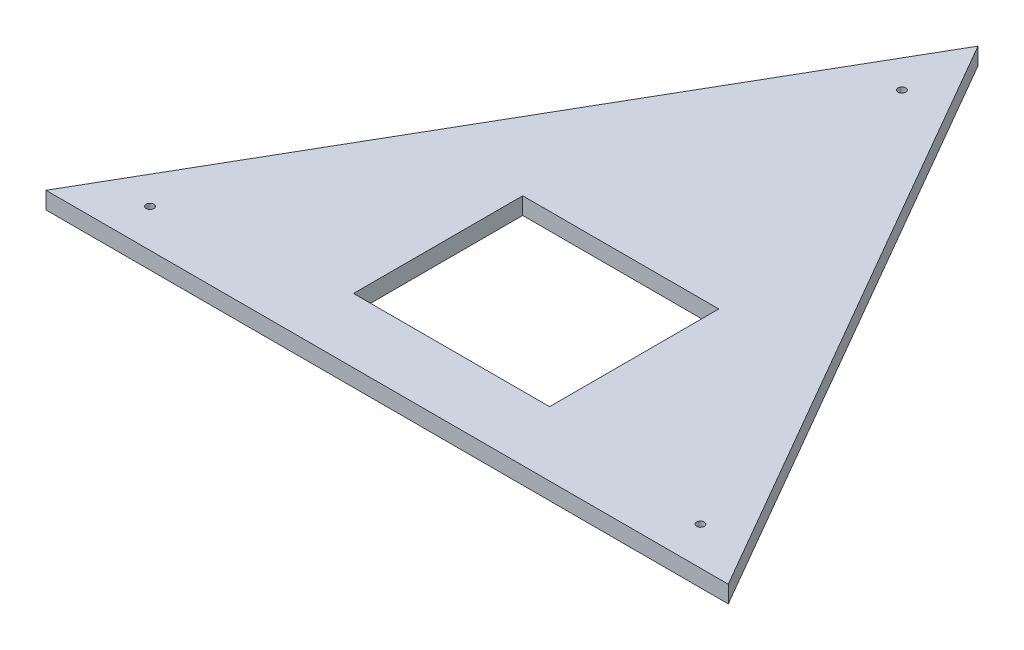
ISO-10303-21;
HEADER;
FILE_DESCRIPTION(('STEP AP214'),'2;1');
FILE_NAME('part.step','',(''),(''),'','','');
FILE_SCHEMA(('AUTOMOTIVE_DESIGN { 1 0 10303 214 1 1 1 1 }'));
ENDSEC;
DATA;
#1=APPLICATION_CONTEXT('core data for automotive mechanical design processes');
#2=APPLICATION_PROTOCOL_DEFINITION('international standard','automotive_design',2000,#1);
#3=PRODUCT_CONTEXT('',#1,'mechanical');
#4=PRODUCT('Part','Part','',(#3));
#5=PRODUCT_RELATED_PRODUCT_CATEGORY('part','',(#4));
#6=PRODUCT_DEFINITION_FORMATION('','',#4);
#7=PRODUCT_DEFINITION_CONTEXT('part definition',#1,'design');
#8=PRODUCT_DEFINITION('design','',#6,#7);
#9=PRODUCT_DEFINITION_SHAPE('','',#8);
#10=(LENGTH_UNIT() NAMED_UNIT(*) SI_UNIT(.MILLI.,.METRE.));
#11=(NAMED_UNIT(*) PLANE_ANGLE_UNIT() SI_UNIT($,.RADIAN.));
#12=(NAMED_UNIT(*) SI_UNIT($,.STERADIAN.) SOLID_ANGLE_UNIT());
#13=UNCERTAINTY_MEASURE_WITH_UNIT(LENGTH_MEASURE(1.E-05),#10,'distance_accuracy_value','');
#14=(GEOMETRIC_REPRESENTATION_CONTEXT(3) GLOBAL_UNCERTAINTY_ASSIGNED_CONTEXT((#13)) GLOBAL_UNIT_ASSIGNED_CONTEXT((#10,
#11,#12)) REPRESENTATION_CONTEXT('',''));
#15=CARTESIAN_POINT('',(0.,0.,0.));
#16=DIRECTION('',(0.,0.,1.));
#17=DIRECTION('',(1.,0.,0.));
#18=AXIS2_PLACEMENT_3D('',#15,#16,#17);
#19=CARTESIAN_POINT('',(127.,6.35,73.3234841870812));
#20=DIRECTION('',(-0.866025403784437,0.,0.500000000000002));
#21=DIRECTION('',(0.500000000000002,0.,0.866025403784437));
#22=AXIS2_PLACEMENT_3D('',#19,#20,#21);
#23=PLANE('',#22);
#24=DIRECTION('',(-0.500000000000002,0.,-0.866025403784437));
#25=VECTOR('',#24,1.);
#26=CARTESIAN_POINT('',(127.,0.,73.3234841870812));
#27=LINE('',#26,#25);
#28=CARTESIAN_POINT('',(127.,0.,73.3234841870812));
#29=VERTEX_POINT('',#28);
#30=CARTESIAN_POINT('',(0.,0.,-146.646968374165));
#31=VERTEX_POINT('',#30);
#32=EDGE_CURVE('E125',#29,#31,#27,.T.);
#33=ORIENTED_EDGE('',*,*,#32,.T.);
#34=DIRECTION('',(0.,-1.,0.));
#35=VECTOR('',#34,1.);
#36=CARTESIAN_POINT('',(0.,6.35,-146.646968374165));
#37=LINE('',#36,#35);
#38=CARTESIAN_POINT('',(0.,6.35,-146.646968374165));
#39=VERTEX_POINT('',#38);
#40=EDGE_CURVE('E11',#39,#31,#37,.T.);
#41=ORIENTED_EDGE('',*,*,#40,.F.);
#42=DIRECTION('',(-0.500000000000002,0.,-0.866025403784437));
#43=VECTOR('',#42,1.);
#44=CARTESIAN_POINT('',(127.,6.35,73.3234841870812));
#45=LINE('',#44,#43);
#46=CARTESIAN_POINT('',(127.,6.35,73.3234841870812));
#47=VERTEX_POINT('',#46);
#48=EDGE_CURVE('E129',#47,#39,#45,.T.);
#49=ORIENTED_EDGE('',*,*,#48,.F.);
#50=DIRECTION('',(0.,-1.,0.));
#51=VECTOR('',#50,1.);
#52=CARTESIAN_POINT('',(127.,6.35,73.3234841870812));
#53=LINE('',#52,#51);
#54=EDGE_CURVE('E137',#47,#29,#53,.T.);
#55=ORIENTED_EDGE('',*,*,#54,.T.);
#56=EDGE_LOOP('',(#33,#41,#49,#55));
#57=FACE_BOUND('',#56,.T.);
#58=ADVANCED_FACE('F32',(#57),#23,.F.);
#59=CARTESIAN_POINT('',(0.,6.35,-146.646968374165));
#60=DIRECTION('',(0.86602540378444,0.,0.499999999999998));
#61=DIRECTION('',(0.499999999999998,0.,-0.86602540378444));
#62=AXIS2_PLACEMENT_3D('',#59,#60,#61);
#63=PLANE('',#62);
#64=DIRECTION('',(-0.499999999999998,0.,0.86602540378444));
#65=VECTOR('',#64,1.);
#66=CARTESIAN_POINT('',(0.,0.,-146.646968374165));
#67=LINE('',#66,#65);
#68=CARTESIAN_POINT('',(-126.999999999999,0.,73.323484187083));
#69=VERTEX_POINT('',#68);
#70=EDGE_CURVE('E140',#31,#69,#67,.T.);
#71=ORIENTED_EDGE('',*,*,#70,.T.);
#72=DIRECTION('',(0.,-1.,0.));
#73=VECTOR('',#72,1.);
#74=CARTESIAN_POINT('',(-126.999999999999,6.35,73.323484187083));
#75=LINE('',#74,#73);
#76=CARTESIAN_POINT('',(-126.999999999999,6.35,73.323484187083));
#77=VERTEX_POINT('',#76);
#78=EDGE_CURVE('E39',#77,#69,#75,.T.);
#79=ORIENTED_EDGE('',*,*,#78,.F.);
#80=DIRECTION('',(-0.499999999999998,0.,0.86602540378444));
#81=VECTOR('',#80,1.);
#82=CARTESIAN_POINT('',(0.,6.35,-146.646968374165));
#83=LINE('',#82,#81);
#84=EDGE_CURVE('E132',#39,#77,#83,.T.);
#85=ORIENTED_EDGE('',*,*,#84,.F.);
#86=ORIENTED_EDGE('',*,*,#40,.T.);
#87=EDGE_LOOP('',(#71,#79,#85,#86));
#88=FACE_BOUND('',#87,.T.);
#89=ADVANCED_FACE('F158',(#88),#63,.F.);
#90=CARTESIAN_POINT('',(-126.999999999999,6.35,73.323484187083));
#91=DIRECTION('',(0.,0.,-1.));
#92=DIRECTION('',(-1.,0.,0.));
#93=AXIS2_PLACEMENT_3D('',#90,#91,#92);
#94=PLANE('',#93);
#95=DIRECTION('',(1.,0.,0.));
#96=VECTOR('',#95,1.);
#97=CARTESIAN_POINT('',(-126.999999999999,0.,73.323484187083));
#98=LINE('',#97,#96);
#99=EDGE_CURVE('E133',#69,#29,#98,.T.);
#100=ORIENTED_EDGE('',*,*,#99,.T.);
#101=ORIENTED_EDGE('',*,*,#54,.F.);
#102=DIRECTION('',(1.,0.,0.));
#103=VECTOR('',#102,1.);
#104=CARTESIAN_POINT('',(-126.999999999999,6.35,73.323484187083));
#105=LINE('',#104,#103);
#106=EDGE_CURVE('E135',#77,#47,#105,.T.);
#107=ORIENTED_EDGE('',*,*,#106,.F.);
#108=ORIENTED_EDGE('',*,*,#78,.T.);
#109=EDGE_LOOP('',(#100,#101,#107,#108));
#110=FACE_BOUND('',#109,.T.);
#111=ADVANCED_FACE('F149',(#110),#94,.F.);
#112=CARTESIAN_POINT('',(0.,6.35,0.));
#113=DIRECTION('',(0.,1.,0.));
#114=DIRECTION('',(0.,0.,1.));
#115=AXIS2_PLACEMENT_3D('',#112,#113,#114);
#116=PLANE('',#115);
#117=CARTESIAN_POINT('',(102.461318102445,6.35,59.1560695879811));
#118=DIRECTION('',(0.,1.,0.));
#119=DIRECTION('',(0.,0.,1.));
#120=AXIS2_PLACEMENT_3D('',#117,#118,#119);
#121=CIRCLE('',#120,1.42240000000446);
#122=CARTESIAN_POINT('',(102.461318102445,6.35,60.5784695879856));
#123=VERTEX_POINT('',#122);
#124=EDGE_CURVE('E203',#123,#123,#121,.T.);
#125=ORIENTED_EDGE('',*,*,#124,.F.);
#126=EDGE_LOOP('',(#125));
#127=FACE_BOUND('',#126,.T.);
#128=CARTESIAN_POINT('',(-102.461318102451,6.35,59.1560695879706));
#129=DIRECTION('',(0.,1.,0.));
#130=DIRECTION('',(0.,0.,1.));
#131=AXIS2_PLACEMENT_3D('',#128,#129,#130);
#132=CIRCLE('',#131,1.42240000000052);
#133=CARTESIAN_POINT('',(-102.461318102451,6.35,60.5784695879711));
#134=VERTEX_POINT('',#133);
#135=EDGE_CURVE('E205',#134,#134,#132,.T.);
#136=ORIENTED_EDGE('',*,*,#135,.F.);
#137=EDGE_LOOP('',(#136));
#138=FACE_BOUND('',#137,.T.);
#139=CARTESIAN_POINT('',(-9.70541664257761E-12,6.35,-118.312139175946));
#140=DIRECTION('',(0.,1.,0.));
#141=DIRECTION('',(0.,0.,1.));
#142=AXIS2_PLACEMENT_3D('',#139,#140,#141);
#143=CIRCLE('',#142,1.42240000000313);
#144=CARTESIAN_POINT('',(-9.70541664257761E-12,6.35,-116.889739175943));
#145=VERTEX_POINT('',#144);
#146=EDGE_CURVE('E112',#145,#145,#143,.T.);
#147=ORIENTED_EDGE('',*,*,#146,.F.);
#148=EDGE_LOOP('',(#147));
#149=FACE_BOUND('',#148,.T.);
#150=DIRECTION('',(0.,0.,1.));
#151=VECTOR('',#150,1.);
#152=CARTESIAN_POINT('',(-36.5,6.35,0.));
#153=LINE('',#152,#151);
#154=CARTESIAN_POINT('',(-36.5,6.35,-13.646515812917));
#155=VERTEX_POINT('',#154);
#156=CARTESIAN_POINT('',(-36.5,6.35,49.353484187083));
#157=VERTEX_POINT('',#156);
#158=EDGE_CURVE('E46',#155,#157,#153,.T.);
#159=ORIENTED_EDGE('',*,*,#158,.F.);
#160=DIRECTION('',(1.,0.,0.));
#161=VECTOR('',#160,1.);
#162=CARTESIAN_POINT('',(0.,6.35,-13.646515812917));
#163=LINE('',#162,#161);
#164=CARTESIAN_POINT('',(36.5,6.35,-13.646515812917));
#165=VERTEX_POINT('',#164);
#166=EDGE_CURVE('E106',#155,#165,#163,.T.);
#167=ORIENTED_EDGE('',*,*,#166,.T.);
#168=DIRECTION('',(0.,0.,1.));
#169=VECTOR('',#168,1.);
#170=CARTESIAN_POINT('',(36.5,6.35,0.));
#171=LINE('',#170,#169);
#172=CARTESIAN_POINT('',(36.5,6.35,49.353484187083));
#173=VERTEX_POINT('',#172);
#174=EDGE_CURVE('E109',#165,#173,#171,.T.);
#175=ORIENTED_EDGE('',*,*,#174,.T.);
#176=DIRECTION('',(1.,0.,0.));
#177=VECTOR('',#176,1.);
#178=CARTESIAN_POINT('',(0.,6.35,49.353484187083));
#179=LINE('',#178,#177);
#180=EDGE_CURVE('E118',#157,#173,#179,.T.);
#181=ORIENTED_EDGE('',*,*,#180,.F.);
#182=EDGE_LOOP('',(#159,#167,#175,#181));
#183=FACE_BOUND('',#182,.T.);
#184=ORIENTED_EDGE('',*,*,#48,.T.);
#185=ORIENTED_EDGE('',*,*,#84,.T.);
#186=ORIENTED_EDGE('',*,*,#106,.T.);
#187=EDGE_LOOP('',(#184,#185,#186));
#188=FACE_BOUND('',#187,.T.);
#189=ADVANCED_FACE('F157',(#127,#138,#149,#183,#188),#116,.T.);
#190=CARTESIAN_POINT('',(0.,0.,0.));
#191=DIRECTION('',(0.,1.,0.));
#192=DIRECTION('',(0.,0.,1.));
#193=AXIS2_PLACEMENT_3D('',#190,#191,#192);
#194=PLANE('',#193);
#195=CARTESIAN_POINT('',(102.461318102445,0.,59.1560695879811));
#196=DIRECTION('',(0.,1.,0.));
#197=DIRECTION('',(0.,0.,1.));
#198=AXIS2_PLACEMENT_3D('',#195,#196,#197);
#199=CIRCLE('',#198,1.42240000000446);
#200=CARTESIAN_POINT('',(102.461318102445,0.,60.5784695879856));
#201=VERTEX_POINT('',#200);
#202=EDGE_CURVE('E200',#201,#201,#199,.T.);
#203=ORIENTED_EDGE('',*,*,#202,.T.);
#204=EDGE_LOOP('',(#203));
#205=FACE_BOUND('',#204,.T.);
#206=CARTESIAN_POINT('',(-102.461318102451,0.,59.1560695879706));
#207=DIRECTION('',(0.,1.,0.));
#208=DIRECTION('',(0.,0.,1.));
#209=AXIS2_PLACEMENT_3D('',#206,#207,#208);
#210=CIRCLE('',#209,1.42240000000052);
#211=CARTESIAN_POINT('',(-102.461318102451,0.,60.5784695879711));
#212=VERTEX_POINT('',#211);
#213=EDGE_CURVE('E208',#212,#212,#210,.T.);
#214=ORIENTED_EDGE('',*,*,#213,.T.);
#215=EDGE_LOOP('',(#214));
#216=FACE_BOUND('',#215,.T.);
#217=CARTESIAN_POINT('',(-9.70541664257761E-12,0.,-118.312139175946));
#218=DIRECTION('',(0.,1.,0.));
#219=DIRECTION('',(0.,0.,1.));
#220=AXIS2_PLACEMENT_3D('',#217,#218,#219);
#221=CIRCLE('',#220,1.42240000000313);
#222=CARTESIAN_POINT('',(-9.70541664257761E-12,0.,-116.889739175943));
#223=VERTEX_POINT('',#222);
#224=EDGE_CURVE('E119',#223,#223,#221,.T.);
#225=ORIENTED_EDGE('',*,*,#224,.T.);
#226=EDGE_LOOP('',(#225));
#227=FACE_BOUND('',#226,.T.);
#228=DIRECTION('',(1.,0.,0.));
#229=VECTOR('',#228,1.);
#230=CARTESIAN_POINT('',(0.,0.,-13.646515812917));
#231=LINE('',#230,#229);
#232=CARTESIAN_POINT('',(-36.5,0.,-13.646515812917));
#233=VERTEX_POINT('',#232);
#234=CARTESIAN_POINT('',(36.5,0.,-13.646515812917));
#235=VERTEX_POINT('',#234);
#236=EDGE_CURVE('E95',#233,#235,#231,.T.);
#237=ORIENTED_EDGE('',*,*,#236,.F.);
#238=DIRECTION('',(0.,0.,1.));
#239=VECTOR('',#238,1.);
#240=CARTESIAN_POINT('',(-36.5,0.,0.));
#241=LINE('',#240,#239);
#242=CARTESIAN_POINT('',(-36.5,0.,49.353484187083));
#243=VERTEX_POINT('',#242);
#244=EDGE_CURVE('E92',#233,#243,#241,.T.);
#245=ORIENTED_EDGE('',*,*,#244,.T.);
#246=DIRECTION('',(1.,0.,0.));
#247=VECTOR('',#246,1.);
#248=CARTESIAN_POINT('',(0.,0.,49.353484187083));
#249=LINE('',#248,#247);
#250=CARTESIAN_POINT('',(36.5,0.,49.353484187083));
#251=VERTEX_POINT('',#250);
#252=EDGE_CURVE('E98',#243,#251,#249,.T.);
#253=ORIENTED_EDGE('',*,*,#252,.T.);
#254=DIRECTION('',(0.,0.,1.));
#255=VECTOR('',#254,1.);
#256=CARTESIAN_POINT('',(36.5,0.,0.));
#257=LINE('',#256,#255);
#258=EDGE_CURVE('E102',#235,#251,#257,.T.);
#259=ORIENTED_EDGE('',*,*,#258,.F.);
#260=EDGE_LOOP('',(#237,#245,#253,#259));
#261=FACE_BOUND('',#260,.T.);
#262=ORIENTED_EDGE('',*,*,#32,.F.);
#263=ORIENTED_EDGE('',*,*,#99,.F.);
#264=ORIENTED_EDGE('',*,*,#70,.F.);
#265=EDGE_LOOP('',(#262,#263,#264));
#266=FACE_BOUND('',#265,.T.);
#267=ADVANCED_FACE('F104',(#205,#216,#227,#261,#266),#194,.F.);
#268=CARTESIAN_POINT('',(-36.5,0.,0.));
#269=DIRECTION('',(-1.,0.,0.));
#270=DIRECTION('',(0.,0.,1.));
#271=AXIS2_PLACEMENT_3D('',#268,#269,#270);
#272=PLANE('',#271);
#273=ORIENTED_EDGE('',*,*,#158,.T.);
#274=DIRECTION('',(0.,1.,0.));
#275=VECTOR('',#274,1.);
#276=CARTESIAN_POINT('',(-36.5,0.,49.353484187083));
#277=LINE('',#276,#275);
#278=EDGE_CURVE('E89',#243,#157,#277,.T.);
#279=ORIENTED_EDGE('',*,*,#278,.F.);
#280=ORIENTED_EDGE('',*,*,#244,.F.);
#281=DIRECTION('',(0.,1.,0.));
#282=VECTOR('',#281,1.);
#283=CARTESIAN_POINT('',(-36.5,0.,-13.646515812917));
#284=LINE('',#283,#282);
#285=EDGE_CURVE('E123',#233,#155,#284,.T.);
#286=ORIENTED_EDGE('',*,*,#285,.T.);
#287=EDGE_LOOP('',(#273,#279,#280,#286));
#288=FACE_BOUND('',#287,.T.);
#289=ADVANCED_FACE('F90',(#288),#272,.F.);
#290=CARTESIAN_POINT('',(0.,0.,-13.646515812917));
#291=DIRECTION('',(0.,0.,1.));
#292=DIRECTION('',(1.,0.,0.));
#293=AXIS2_PLACEMENT_3D('',#290,#291,#292);
#294=PLANE('',#293);
#295=ORIENTED_EDGE('',*,*,#166,.F.);
#296=ORIENTED_EDGE('',*,*,#285,.F.);
#297=ORIENTED_EDGE('',*,*,#236,.T.);
#298=DIRECTION('',(0.,1.,0.));
#299=VECTOR('',#298,1.);
#300=CARTESIAN_POINT('',(36.5,0.,-13.646515812917));
#301=LINE('',#300,#299);
#302=EDGE_CURVE('E126',#235,#165,#301,.T.);
#303=ORIENTED_EDGE('',*,*,#302,.T.);
#304=EDGE_LOOP('',(#295,#296,#297,#303));
#305=FACE_BOUND('',#304,.T.);
#306=ADVANCED_FACE('F174',(#305),#294,.T.);
#307=CARTESIAN_POINT('',(36.5,0.,0.));
#308=DIRECTION('',(-1.,0.,0.));
#309=DIRECTION('',(0.,0.,1.));
#310=AXIS2_PLACEMENT_3D('',#307,#308,#309);
#311=PLANE('',#310);
#312=ORIENTED_EDGE('',*,*,#174,.F.);
#313=ORIENTED_EDGE('',*,*,#302,.F.);
#314=ORIENTED_EDGE('',*,*,#258,.T.);
#315=DIRECTION('',(0.,1.,0.));
#316=VECTOR('',#315,1.);
#317=CARTESIAN_POINT('',(36.5,0.,49.353484187083));
#318=LINE('',#317,#316);
#319=EDGE_CURVE('E54',#251,#173,#318,.T.);
#320=ORIENTED_EDGE('',*,*,#319,.T.);
#321=EDGE_LOOP('',(#312,#313,#314,#320));
#322=FACE_BOUND('',#321,.T.);
#323=ADVANCED_FACE('F178',(#322),#311,.T.);
#324=CARTESIAN_POINT('',(0.,0.,49.353484187083));
#325=DIRECTION('',(0.,0.,1.));
#326=DIRECTION('',(1.,0.,0.));
#327=AXIS2_PLACEMENT_3D('',#324,#325,#326);
#328=PLANE('',#327);
#329=ORIENTED_EDGE('',*,*,#180,.T.);
#330=ORIENTED_EDGE('',*,*,#319,.F.);
#331=ORIENTED_EDGE('',*,*,#252,.F.);
#332=ORIENTED_EDGE('',*,*,#278,.T.);
#333=EDGE_LOOP('',(#329,#330,#331,#332));
#334=FACE_BOUND('',#333,.T.);
#335=ADVANCED_FACE('F99',(#334),#328,.F.);
#336=CARTESIAN_POINT('',(-9.70541664257761E-12,0.,-118.312139175946));
#337=DIRECTION('',(0.,1.,0.));
#338=DIRECTION('',(0.,0.,1.));
#339=AXIS2_PLACEMENT_3D('',#336,#337,#338);
#340=CYLINDRICAL_SURFACE('',#339,1.42240000000313);
#341=ORIENTED_EDGE('',*,*,#224,.F.);
#342=EDGE_LOOP('',(#341));
#343=FACE_BOUND('',#342,.T.);
#344=ORIENTED_EDGE('',*,*,#146,.T.);
#345=EDGE_LOOP('',(#344));
#346=FACE_BOUND('',#345,.T.);
#347=ADVANCED_FACE('F177',(#343,#346),#340,.F.);
#348=CARTESIAN_POINT('',(-102.461318102451,0.,59.1560695879706));
#349=DIRECTION('',(0.,1.,0.));
#350=DIRECTION('',(0.,0.,1.));
#351=AXIS2_PLACEMENT_3D('',#348,#349,#350);
#352=CYLINDRICAL_SURFACE('',#351,1.42240000000052);
#353=ORIENTED_EDGE('',*,*,#213,.F.);
#354=EDGE_LOOP('',(#353));
#355=FACE_BOUND('',#354,.T.);
#356=ORIENTED_EDGE('',*,*,#135,.T.);
#357=EDGE_LOOP('',(#356));
#358=FACE_BOUND('',#357,.T.);
#359=ADVANCED_FACE('F187',(#355,#358),#352,.F.);
#360=CARTESIAN_POINT('',(102.461318102445,0.,59.1560695879811));
#361=DIRECTION('',(0.,1.,0.));
#362=DIRECTION('',(0.,0.,1.));
#363=AXIS2_PLACEMENT_3D('',#360,#361,#362);
#364=CYLINDRICAL_SURFACE('',#363,1.42240000000446);
#365=ORIENTED_EDGE('',*,*,#202,.F.);
#366=EDGE_LOOP('',(#365));
#367=FACE_BOUND('',#366,.T.);
#368=ORIENTED_EDGE('',*,*,#124,.T.);
#369=EDGE_LOOP('',(#368));
#370=FACE_BOUND('',#369,.T.);
#371=ADVANCED_FACE('F191',(#367,#370),#364,.F.);
#372=CLOSED_SHELL('',(#58,#89,#111,#189,#267,#289,#306,#323,#335,#347,#359,#371));
#373=MANIFOLD_SOLID_BREP('B2',#372);
#374=ADVANCED_BREP_SHAPE_REPRESENTATION('',(#18,#373),#14);
#375=SHAPE_DEFINITION_REPRESENTATION(#9,#374);
ENDSEC;
END-ISO-10303-21;
